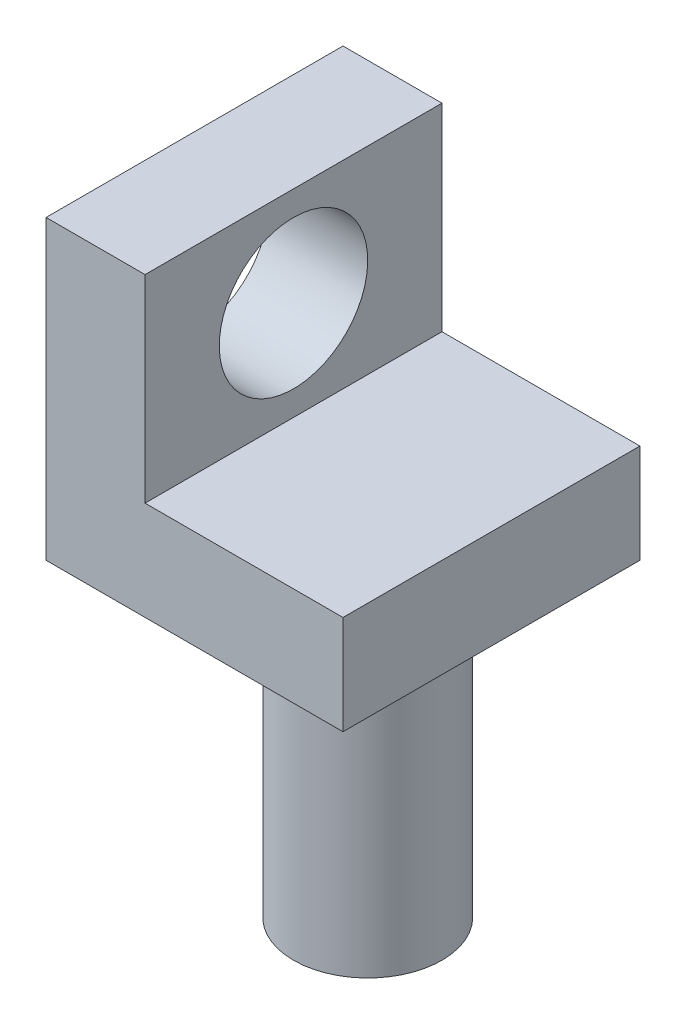
ISO-10303-21;
HEADER;
FILE_DESCRIPTION(('STEP AP214'),'2;1');
FILE_NAME('part.step','',(''),(''),'','','');
FILE_SCHEMA(('AUTOMOTIVE_DESIGN { 1 0 10303 214 1 1 1 1 }'));
ENDSEC;
DATA;
#1=APPLICATION_CONTEXT('core data for automotive mechanical design processes');
#2=APPLICATION_PROTOCOL_DEFINITION('international standard','automotive_design',2000,#1);
#3=PRODUCT_CONTEXT('',#1,'mechanical');
#4=PRODUCT('Part','Part','',(#3));
#5=PRODUCT_RELATED_PRODUCT_CATEGORY('part','',(#4));
#6=PRODUCT_DEFINITION_FORMATION('','',#4);
#7=PRODUCT_DEFINITION_CONTEXT('part definition',#1,'design');
#8=PRODUCT_DEFINITION('design','',#6,#7);
#9=PRODUCT_DEFINITION_SHAPE('','',#8);
#10=(LENGTH_UNIT() NAMED_UNIT(*) SI_UNIT(.MILLI.,.METRE.));
#11=(NAMED_UNIT(*) PLANE_ANGLE_UNIT() SI_UNIT($,.RADIAN.));
#12=(NAMED_UNIT(*) SI_UNIT($,.STERADIAN.) SOLID_ANGLE_UNIT());
#13=UNCERTAINTY_MEASURE_WITH_UNIT(LENGTH_MEASURE(1.E-05),#10,'distance_accuracy_value','');
#14=(GEOMETRIC_REPRESENTATION_CONTEXT(3) GLOBAL_UNCERTAINTY_ASSIGNED_CONTEXT((#13)) GLOBAL_UNIT_ASSIGNED_CONTEXT((#10,
#11,#12)) REPRESENTATION_CONTEXT('',''));
#15=CARTESIAN_POINT('',(0.,0.,0.));
#16=DIRECTION('',(0.,0.,1.));
#17=DIRECTION('',(1.,0.,0.));
#18=AXIS2_PLACEMENT_3D('',#15,#16,#17);
#19=CARTESIAN_POINT('',(0.,30.,0.));
#20=DIRECTION('',(0.,-1.,0.));
#21=DIRECTION('',(0.,0.,-1.));
#22=AXIS2_PLACEMENT_3D('',#19,#20,#21);
#23=CYLINDRICAL_SURFACE('',#22,7.5);
#24=CARTESIAN_POINT('',(0.,30.,0.));
#25=DIRECTION('',(0.,1.,0.));
#26=DIRECTION('',(0.,0.,1.));
#27=AXIS2_PLACEMENT_3D('',#24,#25,#26);
#28=CIRCLE('',#27,7.5);
#29=CARTESIAN_POINT('',(0.,30.,7.5));
#30=VERTEX_POINT('',#29);
#31=EDGE_CURVE('E11',#30,#30,#28,.T.);
#32=ORIENTED_EDGE('',*,*,#31,.F.);
#33=EDGE_LOOP('',(#32));
#34=FACE_BOUND('',#33,.T.);
#35=CARTESIAN_POINT('',(0.,0.,0.));
#36=DIRECTION('',(0.,1.,0.));
#37=DIRECTION('',(0.,0.,1.));
#38=AXIS2_PLACEMENT_3D('',#35,#36,#37);
#39=CIRCLE('',#38,7.5);
#40=CARTESIAN_POINT('',(0.,0.,7.5));
#41=VERTEX_POINT('',#40);
#42=EDGE_CURVE('E35',#41,#41,#39,.T.);
#43=ORIENTED_EDGE('',*,*,#42,.T.);
#44=EDGE_LOOP('',(#43));
#45=FACE_BOUND('',#44,.T.);
#46=ADVANCED_FACE('F32',(#34,#45),#23,.T.);
#47=CARTESIAN_POINT('',(0.,0.,0.));
#48=DIRECTION('',(0.,1.,0.));
#49=DIRECTION('',(0.,0.,1.));
#50=AXIS2_PLACEMENT_3D('',#47,#48,#49);
#51=PLANE('',#50);
#52=ORIENTED_EDGE('',*,*,#42,.F.);
#53=EDGE_LOOP('',(#52));
#54=FACE_BOUND('',#53,.T.);
#55=ADVANCED_FACE('F141',(#54),#51,.F.);
#56=CARTESIAN_POINT('',(-17.5,30.,15.));
#57=DIRECTION('',(1.,0.,0.));
#58=DIRECTION('',(0.,0.,-1.));
#59=AXIS2_PLACEMENT_3D('',#56,#57,#58);
#60=PLANE('',#59);
#61=CARTESIAN_POINT('',(-17.5,50.,0.));
#62=DIRECTION('',(1.,0.,0.));
#63=DIRECTION('',(0.,0.,-1.));
#64=AXIS2_PLACEMENT_3D('',#61,#62,#63);
#65=CIRCLE('',#64,7.5);
#66=CARTESIAN_POINT('',(-17.5,50.,-7.5));
#67=VERTEX_POINT('',#66);
#68=EDGE_CURVE('E121',#67,#67,#65,.T.);
#69=ORIENTED_EDGE('',*,*,#68,.T.);
#70=EDGE_LOOP('',(#69));
#71=FACE_BOUND('',#70,.T.);
#72=DIRECTION('',(0.,-1.,0.));
#73=VECTOR('',#72,1.);
#74=CARTESIAN_POINT('',(-17.5,30.,-15.));
#75=LINE('',#74,#73);
#76=CARTESIAN_POINT('',(-17.5,60.,-15.));
#77=VERTEX_POINT('',#76);
#78=CARTESIAN_POINT('',(-17.5,30.,-15.));
#79=VERTEX_POINT('',#78);
#80=EDGE_CURVE('E117',#77,#79,#75,.T.);
#81=ORIENTED_EDGE('',*,*,#80,.T.);
#82=DIRECTION('',(0.,0.,-1.));
#83=VECTOR('',#82,1.);
#84=CARTESIAN_POINT('',(-17.5,30.,15.));
#85=LINE('',#84,#83);
#86=CARTESIAN_POINT('',(-17.5,30.,15.));
#87=VERTEX_POINT('',#86);
#88=EDGE_CURVE('E135',#87,#79,#85,.T.);
#89=ORIENTED_EDGE('',*,*,#88,.F.);
#90=DIRECTION('',(0.,-1.,0.));
#91=VECTOR('',#90,1.);
#92=CARTESIAN_POINT('',(-17.5,30.,15.));
#93=LINE('',#92,#91);
#94=CARTESIAN_POINT('',(-17.5,60.,15.));
#95=VERTEX_POINT('',#94);
#96=EDGE_CURVE('E128',#95,#87,#93,.T.);
#97=ORIENTED_EDGE('',*,*,#96,.F.);
#98=DIRECTION('',(0.,0.,-1.));
#99=VECTOR('',#98,1.);
#100=CARTESIAN_POINT('',(-17.5,60.,15.));
#101=LINE('',#100,#99);
#102=EDGE_CURVE('E113',#95,#77,#101,.T.);
#103=ORIENTED_EDGE('',*,*,#102,.T.);
#104=EDGE_LOOP('',(#81,#89,#97,#103));
#105=FACE_BOUND('',#104,.T.);
#106=ADVANCED_FACE('F143',(#71,#105),#60,.F.);
#107=CARTESIAN_POINT('',(-17.5,30.,15.));
#108=DIRECTION('',(0.,1.,0.));
#109=DIRECTION('',(0.,0.,1.));
#110=AXIS2_PLACEMENT_3D('',#107,#108,#109);
#111=PLANE('',#110);
#112=ORIENTED_EDGE('',*,*,#31,.T.);
#113=EDGE_LOOP('',(#112));
#114=FACE_BOUND('',#113,.T.);
#115=DIRECTION('',(1.,0.,0.));
#116=VECTOR('',#115,1.);
#117=CARTESIAN_POINT('',(-17.5,30.,-15.));
#118=LINE('',#117,#116);
#119=CARTESIAN_POINT('',(12.5,30.,-15.));
#120=VERTEX_POINT('',#119);
#121=EDGE_CURVE('E120',#79,#120,#118,.T.);
#122=ORIENTED_EDGE('',*,*,#121,.T.);
#123=DIRECTION('',(0.,0.,-1.));
#124=VECTOR('',#123,1.);
#125=CARTESIAN_POINT('',(12.5,30.,15.));
#126=LINE('',#125,#124);
#127=CARTESIAN_POINT('',(12.5,30.,15.));
#128=VERTEX_POINT('',#127);
#129=EDGE_CURVE('E132',#128,#120,#126,.T.);
#130=ORIENTED_EDGE('',*,*,#129,.F.);
#131=DIRECTION('',(1.,0.,0.));
#132=VECTOR('',#131,1.);
#133=CARTESIAN_POINT('',(-17.5,30.,15.));
#134=LINE('',#133,#132);
#135=EDGE_CURVE('E86',#87,#128,#134,.T.);
#136=ORIENTED_EDGE('',*,*,#135,.F.);
#137=ORIENTED_EDGE('',*,*,#88,.T.);
#138=EDGE_LOOP('',(#122,#130,#136,#137));
#139=FACE_BOUND('',#138,.T.);
#140=ADVANCED_FACE('F148',(#114,#139),#111,.F.);
#141=CARTESIAN_POINT('',(12.5,30.,15.));
#142=DIRECTION('',(-1.,0.,0.));
#143=DIRECTION('',(0.,0.,1.));
#144=AXIS2_PLACEMENT_3D('',#141,#142,#143);
#145=PLANE('',#144);
#146=DIRECTION('',(0.,1.,0.));
#147=VECTOR('',#146,1.);
#148=CARTESIAN_POINT('',(12.5,30.,-15.));
#149=LINE('',#148,#147);
#150=CARTESIAN_POINT('',(12.5,40.,-15.));
#151=VERTEX_POINT('',#150);
#152=EDGE_CURVE('E123',#120,#151,#149,.T.);
#153=ORIENTED_EDGE('',*,*,#152,.T.);
#154=DIRECTION('',(0.,0.,-1.));
#155=VECTOR('',#154,1.);
#156=CARTESIAN_POINT('',(12.5,40.,15.));
#157=LINE('',#156,#155);
#158=CARTESIAN_POINT('',(12.5,40.,15.));
#159=VERTEX_POINT('',#158);
#160=EDGE_CURVE('E108',#159,#151,#157,.T.);
#161=ORIENTED_EDGE('',*,*,#160,.F.);
#162=DIRECTION('',(0.,1.,0.));
#163=VECTOR('',#162,1.);
#164=CARTESIAN_POINT('',(12.5,30.,15.));
#165=LINE('',#164,#163);
#166=EDGE_CURVE('E99',#128,#159,#165,.T.);
#167=ORIENTED_EDGE('',*,*,#166,.F.);
#168=ORIENTED_EDGE('',*,*,#129,.T.);
#169=EDGE_LOOP('',(#153,#161,#167,#168));
#170=FACE_BOUND('',#169,.T.);
#171=ADVANCED_FACE('F155',(#170),#145,.F.);
#172=CARTESIAN_POINT('',(-7.5,40.,15.));
#173=DIRECTION('',(0.,-1.,0.));
#174=DIRECTION('',(0.,0.,-1.));
#175=AXIS2_PLACEMENT_3D('',#172,#173,#174);
#176=PLANE('',#175);
#177=DIRECTION('',(-1.,0.,0.));
#178=VECTOR('',#177,1.);
#179=CARTESIAN_POINT('',(-7.5,40.,-15.));
#180=LINE('',#179,#178);
#181=CARTESIAN_POINT('',(-7.5,40.,-15.));
#182=VERTEX_POINT('',#181);
#183=EDGE_CURVE('E107',#151,#182,#180,.T.);
#184=ORIENTED_EDGE('',*,*,#183,.T.);
#185=DIRECTION('',(0.,0.,-1.));
#186=VECTOR('',#185,1.);
#187=CARTESIAN_POINT('',(-7.5,40.,15.));
#188=LINE('',#187,#186);
#189=CARTESIAN_POINT('',(-7.5,40.,15.));
#190=VERTEX_POINT('',#189);
#191=EDGE_CURVE('E104',#190,#182,#188,.T.);
#192=ORIENTED_EDGE('',*,*,#191,.F.);
#193=DIRECTION('',(-1.,0.,0.));
#194=VECTOR('',#193,1.);
#195=CARTESIAN_POINT('',(-7.5,40.,15.));
#196=LINE('',#195,#194);
#197=EDGE_CURVE('E93',#159,#190,#196,.T.);
#198=ORIENTED_EDGE('',*,*,#197,.F.);
#199=ORIENTED_EDGE('',*,*,#160,.T.);
#200=EDGE_LOOP('',(#184,#192,#198,#199));
#201=FACE_BOUND('',#200,.T.);
#202=ADVANCED_FACE('F105',(#201),#176,.F.);
#203=CARTESIAN_POINT('',(-7.5,60.,15.));
#204=DIRECTION('',(-1.,0.,0.));
#205=DIRECTION('',(0.,-1.,0.));
#206=AXIS2_PLACEMENT_3D('',#203,#204,#205);
#207=PLANE('',#206);
#208=CARTESIAN_POINT('',(-7.5,50.,0.));
#209=DIRECTION('',(1.,0.,0.));
#210=DIRECTION('',(0.,1.,0.));
#211=AXIS2_PLACEMENT_3D('',#208,#209,#210);
#212=CIRCLE('',#211,7.5);
#213=CARTESIAN_POINT('',(-7.5,57.5,0.));
#214=VERTEX_POINT('',#213);
#215=EDGE_CURVE('E182',#214,#214,#212,.T.);
#216=ORIENTED_EDGE('',*,*,#215,.F.);
#217=EDGE_LOOP('',(#216));
#218=FACE_BOUND('',#217,.T.);
#219=DIRECTION('',(0.,1.,0.));
#220=VECTOR('',#219,1.);
#221=CARTESIAN_POINT('',(-7.5,60.,-15.));
#222=LINE('',#221,#220);
#223=CARTESIAN_POINT('',(-7.5,60.,-15.));
#224=VERTEX_POINT('',#223);
#225=EDGE_CURVE('E71',#182,#224,#222,.T.);
#226=ORIENTED_EDGE('',*,*,#225,.T.);
#227=DIRECTION('',(0.,0.,-1.));
#228=VECTOR('',#227,1.);
#229=CARTESIAN_POINT('',(-7.5,60.,15.));
#230=LINE('',#229,#228);
#231=CARTESIAN_POINT('',(-7.5,60.,15.));
#232=VERTEX_POINT('',#231);
#233=EDGE_CURVE('E109',#232,#224,#230,.T.);
#234=ORIENTED_EDGE('',*,*,#233,.F.);
#235=DIRECTION('',(0.,1.,0.));
#236=VECTOR('',#235,1.);
#237=CARTESIAN_POINT('',(-7.5,60.,15.));
#238=LINE('',#237,#236);
#239=EDGE_CURVE('E97',#190,#232,#238,.T.);
#240=ORIENTED_EDGE('',*,*,#239,.F.);
#241=ORIENTED_EDGE('',*,*,#191,.T.);
#242=EDGE_LOOP('',(#226,#234,#240,#241));
#243=FACE_BOUND('',#242,.T.);
#244=ADVANCED_FACE('F111',(#218,#243),#207,.F.);
#245=CARTESIAN_POINT('',(-17.5,60.,15.));
#246=DIRECTION('',(0.,-1.,0.));
#247=DIRECTION('',(0.,0.,-1.));
#248=AXIS2_PLACEMENT_3D('',#245,#246,#247);
#249=PLANE('',#248);
#250=DIRECTION('',(-1.,0.,0.));
#251=VECTOR('',#250,1.);
#252=CARTESIAN_POINT('',(-17.5,60.,-15.));
#253=LINE('',#252,#251);
#254=EDGE_CURVE('E77',#224,#77,#253,.T.);
#255=ORIENTED_EDGE('',*,*,#254,.T.);
#256=ORIENTED_EDGE('',*,*,#102,.F.);
#257=DIRECTION('',(-1.,0.,0.));
#258=VECTOR('',#257,1.);
#259=CARTESIAN_POINT('',(-17.5,60.,15.));
#260=LINE('',#259,#258);
#261=EDGE_CURVE('E48',#232,#95,#260,.T.);
#262=ORIENTED_EDGE('',*,*,#261,.F.);
#263=ORIENTED_EDGE('',*,*,#233,.T.);
#264=EDGE_LOOP('',(#255,#256,#262,#263));
#265=FACE_BOUND('',#264,.T.);
#266=ADVANCED_FACE('F164',(#265),#249,.F.);
#267=CARTESIAN_POINT('',(0.,0.,15.));
#268=DIRECTION('',(0.,0.,-1.));
#269=DIRECTION('',(-1.,0.,0.));
#270=AXIS2_PLACEMENT_3D('',#267,#268,#269);
#271=PLANE('',#270);
#272=ORIENTED_EDGE('',*,*,#96,.T.);
#273=ORIENTED_EDGE('',*,*,#135,.T.);
#274=ORIENTED_EDGE('',*,*,#166,.T.);
#275=ORIENTED_EDGE('',*,*,#197,.T.);
#276=ORIENTED_EDGE('',*,*,#239,.T.);
#277=ORIENTED_EDGE('',*,*,#261,.T.);
#278=EDGE_LOOP('',(#272,#273,#274,#275,#276,#277));
#279=FACE_BOUND('',#278,.T.);
#280=ADVANCED_FACE('F95',(#279),#271,.F.);
#281=CARTESIAN_POINT('',(0.,0.,-15.));
#282=DIRECTION('',(0.,0.,-1.));
#283=DIRECTION('',(-1.,0.,0.));
#284=AXIS2_PLACEMENT_3D('',#281,#282,#283);
#285=PLANE('',#284);
#286=ORIENTED_EDGE('',*,*,#80,.F.);
#287=ORIENTED_EDGE('',*,*,#254,.F.);
#288=ORIENTED_EDGE('',*,*,#225,.F.);
#289=ORIENTED_EDGE('',*,*,#183,.F.);
#290=ORIENTED_EDGE('',*,*,#152,.F.);
#291=ORIENTED_EDGE('',*,*,#121,.F.);
#292=EDGE_LOOP('',(#286,#287,#288,#289,#290,#291));
#293=FACE_BOUND('',#292,.T.);
#294=ADVANCED_FACE('F168',(#293),#285,.T.);
#295=CARTESIAN_POINT('',(-37.5,50.,0.));
#296=DIRECTION('',(1.,0.,0.));
#297=DIRECTION('',(0.,1.,0.));
#298=AXIS2_PLACEMENT_3D('',#295,#296,#297);
#299=CYLINDRICAL_SURFACE('',#298,7.5);
#300=ORIENTED_EDGE('',*,*,#215,.T.);
#301=EDGE_LOOP('',(#300));
#302=FACE_BOUND('',#301,.T.);
#303=ORIENTED_EDGE('',*,*,#68,.F.);
#304=EDGE_LOOP('',(#303));
#305=FACE_BOUND('',#304,.T.);
#306=ADVANCED_FACE('F171',(#302,#305),#299,.F.);
#307=CLOSED_SHELL('',(#46,#55,#106,#140,#171,#202,#244,#266,#280,#294,#306));
#308=MANIFOLD_SOLID_BREP('B2',#307);
#309=ADVANCED_BREP_SHAPE_REPRESENTATION('',(#18,#308),#14);
#310=SHAPE_DEFINITION_REPRESENTATION(#9,#309);
ENDSEC;
END-ISO-10303-21;
